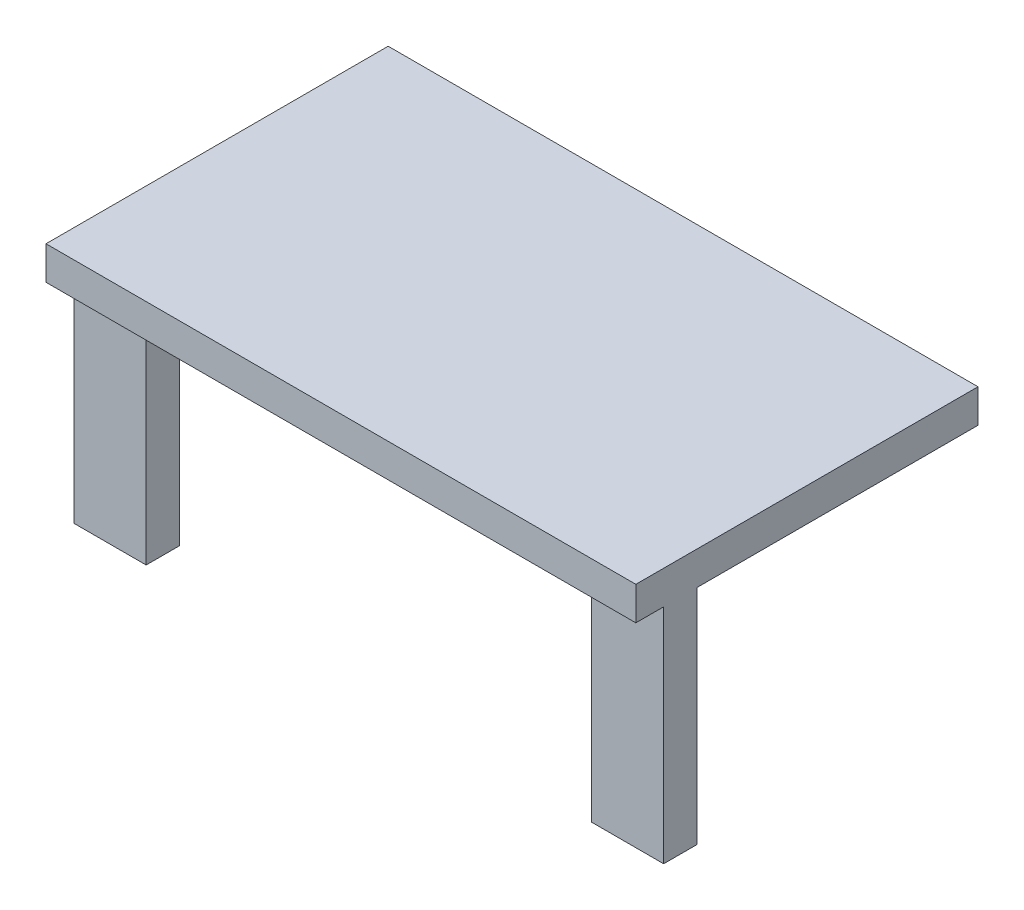
ISO-10303-21;
HEADER;
FILE_DESCRIPTION(('STEP AP214'),'2;1');
FILE_NAME('part.step','',(''),(''),'','','');
FILE_SCHEMA(('AUTOMOTIVE_DESIGN { 1 0 10303 214 1 1 1 1 }'));
ENDSEC;
DATA;
#1=APPLICATION_CONTEXT('core data for automotive mechanical design processes');
#2=APPLICATION_PROTOCOL_DEFINITION('international standard','automotive_design',2000,#1);
#3=PRODUCT_CONTEXT('',#1,'mechanical');
#4=PRODUCT('Part','Part','',(#3));
#5=PRODUCT_RELATED_PRODUCT_CATEGORY('part','',(#4));
#6=PRODUCT_DEFINITION_FORMATION('','',#4);
#7=PRODUCT_DEFINITION_CONTEXT('part definition',#1,'design');
#8=PRODUCT_DEFINITION('design','',#6,#7);
#9=PRODUCT_DEFINITION_SHAPE('','',#8);
#10=(LENGTH_UNIT() NAMED_UNIT(*) SI_UNIT(.MILLI.,.METRE.));
#11=(NAMED_UNIT(*) PLANE_ANGLE_UNIT() SI_UNIT($,.RADIAN.));
#12=(NAMED_UNIT(*) SI_UNIT($,.STERADIAN.) SOLID_ANGLE_UNIT());
#13=UNCERTAINTY_MEASURE_WITH_UNIT(LENGTH_MEASURE(1.E-05),#10,'distance_accuracy_value','');
#14=(GEOMETRIC_REPRESENTATION_CONTEXT(3) GLOBAL_UNCERTAINTY_ASSIGNED_CONTEXT((#13)) GLOBAL_UNIT_ASSIGNED_CONTEXT((#10,
#11,#12)) REPRESENTATION_CONTEXT('',''));
#15=CARTESIAN_POINT('',(0.,0.,0.));
#16=DIRECTION('',(0.,0.,1.));
#17=DIRECTION('',(1.,0.,0.));
#18=AXIS2_PLACEMENT_3D('',#15,#16,#17);
#19=CARTESIAN_POINT('',(0.,0.,0.));
#20=DIRECTION('',(0.,1.,0.));
#21=DIRECTION('',(0.,0.,1.));
#22=AXIS2_PLACEMENT_3D('',#19,#20,#21);
#23=PLANE('',#22);
#24=DIRECTION('',(-1.,0.,0.));
#25=VECTOR('',#24,1.);
#26=CARTESIAN_POINT('',(4.11808915519112,0.,34.9908925903216));
#27=LINE('',#26,#25);
#28=CARTESIAN_POINT('',(4.11808915519112,0.,34.9908925903216));
#29=VERTEX_POINT('',#28);
#30=CARTESIAN_POINT('',(-2.38191084480889,0.,34.9908925903216));
#31=VERTEX_POINT('',#30);
#32=EDGE_CURVE('E257',#29,#31,#27,.T.);
#33=ORIENTED_EDGE('',*,*,#32,.F.);
#34=DIRECTION('',(0.,0.,1.));
#35=VECTOR('',#34,1.);
#36=CARTESIAN_POINT('',(4.11808915519112,0.,34.9908925903216));
#37=LINE('',#36,#35);
#38=CARTESIAN_POINT('',(4.11808915519112,0.,31.9908925903216));
#39=VERTEX_POINT('',#38);
#40=EDGE_CURVE('E142',#39,#29,#37,.T.);
#41=ORIENTED_EDGE('',*,*,#40,.F.);
#42=DIRECTION('',(1.,0.,0.));
#43=VECTOR('',#42,1.);
#44=CARTESIAN_POINT('',(4.11808915519112,0.,31.9908925903216));
#45=LINE('',#44,#43);
#46=CARTESIAN_POINT('',(-2.38191084480889,0.,31.9908925903216));
#47=VERTEX_POINT('',#46);
#48=EDGE_CURVE('E138',#47,#39,#45,.T.);
#49=ORIENTED_EDGE('',*,*,#48,.F.);
#50=DIRECTION('',(0.,0.,1.));
#51=VECTOR('',#50,1.);
#52=CARTESIAN_POINT('',(-2.3819108448089,0.,6.74530636270987));
#53=LINE('',#52,#51);
#54=CARTESIAN_POINT('',(-2.3819108448089,0.,6.74530636270987));
#55=VERTEX_POINT('',#54);
#56=EDGE_CURVE('E188',#55,#47,#53,.T.);
#57=ORIENTED_EDGE('',*,*,#56,.F.);
#58=DIRECTION('',(-1.,0.,0.));
#59=VECTOR('',#58,1.);
#60=CARTESIAN_POINT('',(-2.3819108448089,0.,6.74530636270987));
#61=LINE('',#60,#59);
#62=CARTESIAN_POINT('',(50.6180891551911,0.,6.74530636270987));
#63=VERTEX_POINT('',#62);
#64=EDGE_CURVE('E181',#63,#55,#61,.T.);
#65=ORIENTED_EDGE('',*,*,#64,.F.);
#66=DIRECTION('',(0.,0.,-1.));
#67=VECTOR('',#66,1.);
#68=CARTESIAN_POINT('',(50.6180891551911,0.,6.74530636270987));
#69=LINE('',#68,#67);
#70=CARTESIAN_POINT('',(50.6180891551911,0.,31.9908925903216));
#71=VERTEX_POINT('',#70);
#72=EDGE_CURVE('E193',#71,#63,#69,.T.);
#73=ORIENTED_EDGE('',*,*,#72,.F.);
#74=DIRECTION('',(1.,0.,0.));
#75=VECTOR('',#74,1.);
#76=CARTESIAN_POINT('',(50.6180891551911,0.,31.9908925903216));
#77=LINE('',#76,#75);
#78=CARTESIAN_POINT('',(44.1180891551911,0.,31.9908925903216));
#79=VERTEX_POINT('',#78);
#80=EDGE_CURVE('E56',#79,#71,#77,.T.);
#81=ORIENTED_EDGE('',*,*,#80,.F.);
#82=DIRECTION('',(0.,0.,-1.));
#83=VECTOR('',#82,1.);
#84=CARTESIAN_POINT('',(44.1180891551911,0.,34.9908925903216));
#85=LINE('',#84,#83);
#86=CARTESIAN_POINT('',(44.1180891551911,0.,34.9908925903216));
#87=VERTEX_POINT('',#86);
#88=EDGE_CURVE('E147',#87,#79,#85,.T.);
#89=ORIENTED_EDGE('',*,*,#88,.F.);
#90=DIRECTION('',(-1.,0.,0.));
#91=VECTOR('',#90,1.);
#92=CARTESIAN_POINT('',(50.6180891551911,0.,34.9908925903216));
#93=LINE('',#92,#91);
#94=CARTESIAN_POINT('',(50.6180891551911,0.,34.9908925903216));
#95=VERTEX_POINT('',#94);
#96=EDGE_CURVE('E144',#95,#87,#93,.T.);
#97=ORIENTED_EDGE('',*,*,#96,.F.);
#98=CARTESIAN_POINT('',(50.6180891551911,0.,37.4908925903216));
#99=VERTEX_POINT('',#98);
#100=EDGE_CURVE('E194',#99,#95,#69,.T.);
#101=ORIENTED_EDGE('',*,*,#100,.F.);
#102=DIRECTION('',(1.,0.,0.));
#103=VECTOR('',#102,1.);
#104=CARTESIAN_POINT('',(-2.38191084480889,0.,37.4908925903216));
#105=LINE('',#104,#103);
#106=CARTESIAN_POINT('',(-2.38191084480889,0.,37.4908925903216));
#107=VERTEX_POINT('',#106);
#108=EDGE_CURVE('E191',#107,#99,#105,.T.);
#109=ORIENTED_EDGE('',*,*,#108,.F.);
#110=EDGE_CURVE('E176',#31,#107,#53,.T.);
#111=ORIENTED_EDGE('',*,*,#110,.F.);
#112=EDGE_LOOP('',(#33,#41,#49,#57,#65,#73,#81,#89,#97,#101,#109,#111));
#113=FACE_BOUND('',#112,.T.);
#114=ADVANCED_FACE('F33',(#113),#23,.F.);
#115=CARTESIAN_POINT('',(-2.3819108448089,3.,6.74530636270987));
#116=DIRECTION('',(1.,0.,0.));
#117=DIRECTION('',(0.,0.,-1.));
#118=AXIS2_PLACEMENT_3D('',#115,#116,#117);
#119=PLANE('',#118);
#120=ORIENTED_EDGE('',*,*,#56,.T.);
#121=DIRECTION('',(0.,1.,0.));
#122=VECTOR('',#121,1.);
#123=CARTESIAN_POINT('',(-2.38191084480889,-20.,31.9908925903216));
#124=LINE('',#123,#122);
#125=CARTESIAN_POINT('',(-2.38191084480889,-20.,31.9908925903216));
#126=VERTEX_POINT('',#125);
#127=EDGE_CURVE('E149',#126,#47,#124,.T.);
#128=ORIENTED_EDGE('',*,*,#127,.F.);
#129=DIRECTION('',(0.,0.,-1.));
#130=VECTOR('',#129,1.);
#131=CARTESIAN_POINT('',(-2.38191084480889,-20.,34.9908925903216));
#132=LINE('',#131,#130);
#133=CARTESIAN_POINT('',(-2.38191084480889,-20.,34.9908925903216));
#134=VERTEX_POINT('',#133);
#135=EDGE_CURVE('E128',#134,#126,#132,.T.);
#136=ORIENTED_EDGE('',*,*,#135,.F.);
#137=DIRECTION('',(0.,1.,0.));
#138=VECTOR('',#137,1.);
#139=CARTESIAN_POINT('',(-2.38191084480889,-20.,34.9908925903216));
#140=LINE('',#139,#138);
#141=EDGE_CURVE('E48',#134,#31,#140,.T.);
#142=ORIENTED_EDGE('',*,*,#141,.T.);
#143=ORIENTED_EDGE('',*,*,#110,.T.);
#144=DIRECTION('',(0.,-1.,0.));
#145=VECTOR('',#144,1.);
#146=CARTESIAN_POINT('',(-2.38191084480889,3.,37.4908925903216));
#147=LINE('',#146,#145);
#148=CARTESIAN_POINT('',(-2.38191084480889,3.,37.4908925903216));
#149=VERTEX_POINT('',#148);
#150=EDGE_CURVE('E11',#149,#107,#147,.T.);
#151=ORIENTED_EDGE('',*,*,#150,.F.);
#152=DIRECTION('',(0.,0.,1.));
#153=VECTOR('',#152,1.);
#154=CARTESIAN_POINT('',(-2.3819108448089,3.,6.74530636270987));
#155=LINE('',#154,#153);
#156=CARTESIAN_POINT('',(-2.3819108448089,3.,6.74530636270987));
#157=VERTEX_POINT('',#156);
#158=EDGE_CURVE('E177',#157,#149,#155,.T.);
#159=ORIENTED_EDGE('',*,*,#158,.F.);
#160=DIRECTION('',(0.,-1.,0.));
#161=VECTOR('',#160,1.);
#162=CARTESIAN_POINT('',(-2.3819108448089,3.,6.74530636270987));
#163=LINE('',#162,#161);
#164=EDGE_CURVE('E187',#157,#55,#163,.T.);
#165=ORIENTED_EDGE('',*,*,#164,.T.);
#166=EDGE_LOOP('',(#120,#128,#136,#142,#143,#151,#159,#165));
#167=FACE_BOUND('',#166,.T.);
#168=ADVANCED_FACE('F35',(#167),#119,.F.);
#169=CARTESIAN_POINT('',(-2.38191084480889,3.,37.4908925903216));
#170=DIRECTION('',(0.,0.,-1.));
#171=DIRECTION('',(-1.,0.,0.));
#172=AXIS2_PLACEMENT_3D('',#169,#170,#171);
#173=PLANE('',#172);
#174=ORIENTED_EDGE('',*,*,#108,.T.);
#175=DIRECTION('',(0.,-1.,0.));
#176=VECTOR('',#175,1.);
#177=CARTESIAN_POINT('',(50.6180891551911,3.,37.4908925903216));
#178=LINE('',#177,#176);
#179=CARTESIAN_POINT('',(50.6180891551911,3.,37.4908925903216));
#180=VERTEX_POINT('',#179);
#181=EDGE_CURVE('E41',#180,#99,#178,.T.);
#182=ORIENTED_EDGE('',*,*,#181,.F.);
#183=DIRECTION('',(1.,0.,0.));
#184=VECTOR('',#183,1.);
#185=CARTESIAN_POINT('',(-2.38191084480889,3.,37.4908925903216));
#186=LINE('',#185,#184);
#187=EDGE_CURVE('E180',#149,#180,#186,.T.);
#188=ORIENTED_EDGE('',*,*,#187,.F.);
#189=ORIENTED_EDGE('',*,*,#150,.T.);
#190=EDGE_LOOP('',(#174,#182,#188,#189));
#191=FACE_BOUND('',#190,.T.);
#192=ADVANCED_FACE('F242',(#191),#173,.F.);
#193=CARTESIAN_POINT('',(50.6180891551911,3.,6.74530636270987));
#194=DIRECTION('',(-1.,0.,0.));
#195=DIRECTION('',(0.,0.,1.));
#196=AXIS2_PLACEMENT_3D('',#193,#194,#195);
#197=PLANE('',#196);
#198=ORIENTED_EDGE('',*,*,#100,.T.);
#199=DIRECTION('',(0.,1.,0.));
#200=VECTOR('',#199,1.);
#201=CARTESIAN_POINT('',(50.6180891551911,-20.,34.9908925903216));
#202=LINE('',#201,#200);
#203=CARTESIAN_POINT('',(50.6180891551911,-20.,34.9908925903216));
#204=VERTEX_POINT('',#203);
#205=EDGE_CURVE('E173',#204,#95,#202,.T.);
#206=ORIENTED_EDGE('',*,*,#205,.F.);
#207=DIRECTION('',(0.,0.,1.));
#208=VECTOR('',#207,1.);
#209=CARTESIAN_POINT('',(50.6180891551911,-20.,34.9908925903216));
#210=LINE('',#209,#208);
#211=CARTESIAN_POINT('',(50.6180891551911,-20.,31.9908925903216));
#212=VERTEX_POINT('',#211);
#213=EDGE_CURVE('E153',#212,#204,#210,.T.);
#214=ORIENTED_EDGE('',*,*,#213,.F.);
#215=DIRECTION('',(0.,1.,0.));
#216=VECTOR('',#215,1.);
#217=CARTESIAN_POINT('',(50.6180891551911,-20.,31.9908925903216));
#218=LINE('',#217,#216);
#219=EDGE_CURVE('E161',#212,#71,#218,.T.);
#220=ORIENTED_EDGE('',*,*,#219,.T.);
#221=ORIENTED_EDGE('',*,*,#72,.T.);
#222=DIRECTION('',(0.,-1.,0.));
#223=VECTOR('',#222,1.);
#224=CARTESIAN_POINT('',(50.6180891551911,3.,6.74530636270987));
#225=LINE('',#224,#223);
#226=CARTESIAN_POINT('',(50.6180891551911,3.,6.74530636270987));
#227=VERTEX_POINT('',#226);
#228=EDGE_CURVE('E200',#227,#63,#225,.T.);
#229=ORIENTED_EDGE('',*,*,#228,.F.);
#230=DIRECTION('',(0.,0.,-1.));
#231=VECTOR('',#230,1.);
#232=CARTESIAN_POINT('',(50.6180891551911,3.,6.74530636270987));
#233=LINE('',#232,#231);
#234=EDGE_CURVE('E183',#180,#227,#233,.T.);
#235=ORIENTED_EDGE('',*,*,#234,.F.);
#236=ORIENTED_EDGE('',*,*,#181,.T.);
#237=EDGE_LOOP('',(#198,#206,#214,#220,#221,#229,#235,#236));
#238=FACE_BOUND('',#237,.T.);
#239=ADVANCED_FACE('F207',(#238),#197,.F.);
#240=CARTESIAN_POINT('',(-2.3819108448089,3.,6.74530636270987));
#241=DIRECTION('',(0.,0.,1.));
#242=DIRECTION('',(1.,0.,0.));
#243=AXIS2_PLACEMENT_3D('',#240,#241,#242);
#244=PLANE('',#243);
#245=ORIENTED_EDGE('',*,*,#64,.T.);
#246=ORIENTED_EDGE('',*,*,#164,.F.);
#247=DIRECTION('',(-1.,0.,0.));
#248=VECTOR('',#247,1.);
#249=CARTESIAN_POINT('',(-2.3819108448089,3.,6.74530636270987));
#250=LINE('',#249,#248);
#251=EDGE_CURVE('E185',#227,#157,#250,.T.);
#252=ORIENTED_EDGE('',*,*,#251,.F.);
#253=ORIENTED_EDGE('',*,*,#228,.T.);
#254=EDGE_LOOP('',(#245,#246,#252,#253));
#255=FACE_BOUND('',#254,.T.);
#256=ADVANCED_FACE('F247',(#255),#244,.F.);
#257=CARTESIAN_POINT('',(0.,3.,0.));
#258=DIRECTION('',(0.,1.,0.));
#259=DIRECTION('',(0.,0.,1.));
#260=AXIS2_PLACEMENT_3D('',#257,#258,#259);
#261=PLANE('',#260);
#262=ORIENTED_EDGE('',*,*,#158,.T.);
#263=ORIENTED_EDGE('',*,*,#187,.T.);
#264=ORIENTED_EDGE('',*,*,#234,.T.);
#265=ORIENTED_EDGE('',*,*,#251,.T.);
#266=EDGE_LOOP('',(#262,#263,#264,#265));
#267=FACE_BOUND('',#266,.T.);
#268=ADVANCED_FACE('F245',(#267),#261,.T.);
#269=CARTESIAN_POINT('',(50.6180891551911,-20.,34.9908925903216));
#270=DIRECTION('',(0.,0.,-1.));
#271=DIRECTION('',(-1.,0.,0.));
#272=AXIS2_PLACEMENT_3D('',#269,#270,#271);
#273=PLANE('',#272);
#274=ORIENTED_EDGE('',*,*,#96,.T.);
#275=DIRECTION('',(0.,1.,0.));
#276=VECTOR('',#275,1.);
#277=CARTESIAN_POINT('',(44.1180891551911,-20.,34.9908925903216));
#278=LINE('',#277,#276);
#279=CARTESIAN_POINT('',(44.1180891551911,-20.,34.9908925903216));
#280=VERTEX_POINT('',#279);
#281=EDGE_CURVE('E170',#280,#87,#278,.T.);
#282=ORIENTED_EDGE('',*,*,#281,.F.);
#283=DIRECTION('',(-1.,0.,0.));
#284=VECTOR('',#283,1.);
#285=CARTESIAN_POINT('',(50.6180891551911,-20.,34.9908925903216));
#286=LINE('',#285,#284);
#287=EDGE_CURVE('E156',#204,#280,#286,.T.);
#288=ORIENTED_EDGE('',*,*,#287,.F.);
#289=ORIENTED_EDGE('',*,*,#205,.T.);
#290=EDGE_LOOP('',(#274,#282,#288,#289));
#291=FACE_BOUND('',#290,.T.);
#292=ADVANCED_FACE('F215',(#291),#273,.F.);
#293=CARTESIAN_POINT('',(44.1180891551911,-20.,34.9908925903216));
#294=DIRECTION('',(1.,0.,0.));
#295=DIRECTION('',(0.,0.,-1.));
#296=AXIS2_PLACEMENT_3D('',#293,#294,#295);
#297=PLANE('',#296);
#298=ORIENTED_EDGE('',*,*,#88,.T.);
#299=DIRECTION('',(0.,1.,0.));
#300=VECTOR('',#299,1.);
#301=CARTESIAN_POINT('',(44.1180891551911,-20.,31.9908925903216));
#302=LINE('',#301,#300);
#303=CARTESIAN_POINT('',(44.1180891551911,-20.,31.9908925903216));
#304=VERTEX_POINT('',#303);
#305=EDGE_CURVE('E167',#304,#79,#302,.T.);
#306=ORIENTED_EDGE('',*,*,#305,.F.);
#307=DIRECTION('',(0.,0.,-1.));
#308=VECTOR('',#307,1.);
#309=CARTESIAN_POINT('',(44.1180891551911,-20.,34.9908925903216));
#310=LINE('',#309,#308);
#311=EDGE_CURVE('E158',#280,#304,#310,.T.);
#312=ORIENTED_EDGE('',*,*,#311,.F.);
#313=ORIENTED_EDGE('',*,*,#281,.T.);
#314=EDGE_LOOP('',(#298,#306,#312,#313));
#315=FACE_BOUND('',#314,.T.);
#316=ADVANCED_FACE('F218',(#315),#297,.F.);
#317=CARTESIAN_POINT('',(50.6180891551911,-20.,31.9908925903216));
#318=DIRECTION('',(0.,0.,1.));
#319=DIRECTION('',(1.,0.,0.));
#320=AXIS2_PLACEMENT_3D('',#317,#318,#319);
#321=PLANE('',#320);
#322=ORIENTED_EDGE('',*,*,#80,.T.);
#323=ORIENTED_EDGE('',*,*,#219,.F.);
#324=DIRECTION('',(1.,0.,0.));
#325=VECTOR('',#324,1.);
#326=CARTESIAN_POINT('',(50.6180891551911,-20.,31.9908925903216));
#327=LINE('',#326,#325);
#328=EDGE_CURVE('E160',#304,#212,#327,.T.);
#329=ORIENTED_EDGE('',*,*,#328,.F.);
#330=ORIENTED_EDGE('',*,*,#305,.T.);
#331=EDGE_LOOP('',(#322,#323,#329,#330));
#332=FACE_BOUND('',#331,.T.);
#333=ADVANCED_FACE('F226',(#332),#321,.F.);
#334=CARTESIAN_POINT('',(0.,-20.,0.));
#335=DIRECTION('',(0.,1.,0.));
#336=DIRECTION('',(0.,0.,1.));
#337=AXIS2_PLACEMENT_3D('',#334,#335,#336);
#338=PLANE('',#337);
#339=ORIENTED_EDGE('',*,*,#213,.T.);
#340=ORIENTED_EDGE('',*,*,#287,.T.);
#341=ORIENTED_EDGE('',*,*,#311,.T.);
#342=ORIENTED_EDGE('',*,*,#328,.T.);
#343=EDGE_LOOP('',(#339,#340,#341,#342));
#344=FACE_BOUND('',#343,.T.);
#345=ADVANCED_FACE('F222',(#344),#338,.F.);
#346=CARTESIAN_POINT('',(4.11808915519112,-20.,34.9908925903216));
#347=DIRECTION('',(-1.,0.,0.));
#348=DIRECTION('',(0.,0.,1.));
#349=AXIS2_PLACEMENT_3D('',#346,#347,#348);
#350=PLANE('',#349);
#351=ORIENTED_EDGE('',*,*,#40,.T.);
#352=DIRECTION('',(0.,1.,0.));
#353=VECTOR('',#352,1.);
#354=CARTESIAN_POINT('',(4.11808915519112,-20.,34.9908925903216));
#355=LINE('',#354,#353);
#356=CARTESIAN_POINT('',(4.11808915519112,-20.,34.9908925903216));
#357=VERTEX_POINT('',#356);
#358=EDGE_CURVE('E125',#357,#29,#355,.T.);
#359=ORIENTED_EDGE('',*,*,#358,.F.);
#360=DIRECTION('',(0.,0.,1.));
#361=VECTOR('',#360,1.);
#362=CARTESIAN_POINT('',(4.11808915519112,-20.,34.9908925903216));
#363=LINE('',#362,#361);
#364=CARTESIAN_POINT('',(4.11808915519112,-20.,31.9908925903216));
#365=VERTEX_POINT('',#364);
#366=EDGE_CURVE('E129',#365,#357,#363,.T.);
#367=ORIENTED_EDGE('',*,*,#366,.F.);
#368=DIRECTION('',(0.,1.,0.));
#369=VECTOR('',#368,1.);
#370=CARTESIAN_POINT('',(4.11808915519112,-20.,31.9908925903216));
#371=LINE('',#370,#369);
#372=EDGE_CURVE('E264',#365,#39,#371,.T.);
#373=ORIENTED_EDGE('',*,*,#372,.T.);
#374=EDGE_LOOP('',(#351,#359,#367,#373));
#375=FACE_BOUND('',#374,.T.);
#376=ADVANCED_FACE('F140',(#375),#350,.F.);
#377=CARTESIAN_POINT('',(4.11808915519112,-20.,34.9908925903216));
#378=DIRECTION('',(0.,0.,-1.));
#379=DIRECTION('',(-1.,0.,0.));
#380=AXIS2_PLACEMENT_3D('',#377,#378,#379);
#381=PLANE('',#380);
#382=ORIENTED_EDGE('',*,*,#32,.T.);
#383=ORIENTED_EDGE('',*,*,#141,.F.);
#384=DIRECTION('',(-1.,0.,0.));
#385=VECTOR('',#384,1.);
#386=CARTESIAN_POINT('',(4.11808915519112,-20.,34.9908925903216));
#387=LINE('',#386,#385);
#388=EDGE_CURVE('E121',#357,#134,#387,.T.);
#389=ORIENTED_EDGE('',*,*,#388,.F.);
#390=ORIENTED_EDGE('',*,*,#358,.T.);
#391=EDGE_LOOP('',(#382,#383,#389,#390));
#392=FACE_BOUND('',#391,.T.);
#393=ADVANCED_FACE('F123',(#392),#381,.F.);
#394=CARTESIAN_POINT('',(4.11808915519112,-20.,31.9908925903216));
#395=DIRECTION('',(0.,0.,1.));
#396=DIRECTION('',(1.,0.,0.));
#397=AXIS2_PLACEMENT_3D('',#394,#395,#396);
#398=PLANE('',#397);
#399=ORIENTED_EDGE('',*,*,#48,.T.);
#400=ORIENTED_EDGE('',*,*,#372,.F.);
#401=DIRECTION('',(1.,0.,0.));
#402=VECTOR('',#401,1.);
#403=CARTESIAN_POINT('',(4.11808915519112,-20.,31.9908925903216));
#404=LINE('',#403,#402);
#405=EDGE_CURVE('E134',#126,#365,#404,.T.);
#406=ORIENTED_EDGE('',*,*,#405,.F.);
#407=ORIENTED_EDGE('',*,*,#127,.T.);
#408=EDGE_LOOP('',(#399,#400,#406,#407));
#409=FACE_BOUND('',#408,.T.);
#410=ADVANCED_FACE('F267',(#409),#398,.F.);
#411=CARTESIAN_POINT('',(0.,-20.,0.));
#412=DIRECTION('',(0.,1.,0.));
#413=DIRECTION('',(0.,0.,1.));
#414=AXIS2_PLACEMENT_3D('',#411,#412,#413);
#415=PLANE('',#414);
#416=ORIENTED_EDGE('',*,*,#366,.T.);
#417=ORIENTED_EDGE('',*,*,#388,.T.);
#418=ORIENTED_EDGE('',*,*,#135,.T.);
#419=ORIENTED_EDGE('',*,*,#405,.T.);
#420=EDGE_LOOP('',(#416,#417,#418,#419));
#421=FACE_BOUND('',#420,.T.);
#422=ADVANCED_FACE('F132',(#421),#415,.F.);
#423=CLOSED_SHELL('',(#114,#168,#192,#239,#256,#268,#292,#316,#333,#345,#376,#393,#410,#422));
#424=MANIFOLD_SOLID_BREP('B2',#423);
#425=ADVANCED_BREP_SHAPE_REPRESENTATION('',(#18,#424),#14);
#426=SHAPE_DEFINITION_REPRESENTATION(#9,#425);
ENDSEC;
END-ISO-10303-21;
